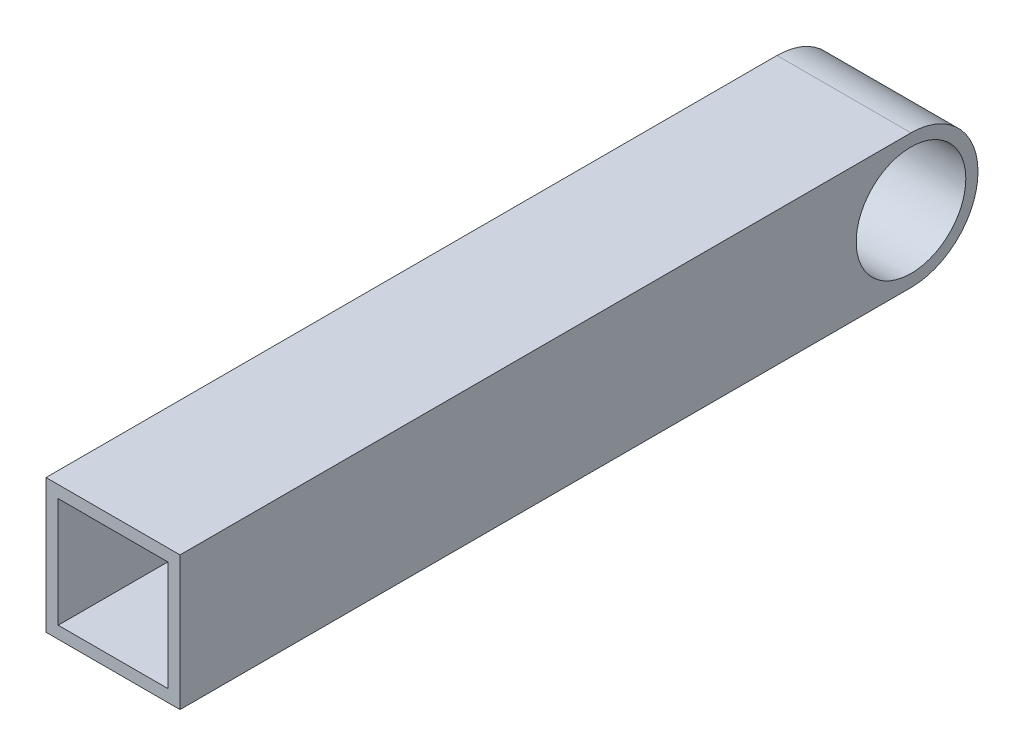
ISO-10303-21;
HEADER;
FILE_DESCRIPTION(('STEP AP214'),'2;1');
FILE_NAME('part.step','',(''),(''),'','','');
FILE_SCHEMA(('AUTOMOTIVE_DESIGN { 1 0 10303 214 1 1 1 1 }'));
ENDSEC;
DATA;
#1=APPLICATION_CONTEXT('core data for automotive mechanical design processes');
#2=APPLICATION_PROTOCOL_DEFINITION('international standard','automotive_design',2000,#1);
#3=PRODUCT_CONTEXT('',#1,'mechanical');
#4=PRODUCT('Part','Part','',(#3));
#5=PRODUCT_RELATED_PRODUCT_CATEGORY('part','',(#4));
#6=PRODUCT_DEFINITION_FORMATION('','',#4);
#7=PRODUCT_DEFINITION_CONTEXT('part definition',#1,'design');
#8=PRODUCT_DEFINITION('design','',#6,#7);
#9=PRODUCT_DEFINITION_SHAPE('','',#8);
#10=(LENGTH_UNIT() NAMED_UNIT(*) SI_UNIT(.MILLI.,.METRE.));
#11=(NAMED_UNIT(*) PLANE_ANGLE_UNIT() SI_UNIT($,.RADIAN.));
#12=(NAMED_UNIT(*) SI_UNIT($,.STERADIAN.) SOLID_ANGLE_UNIT());
#13=UNCERTAINTY_MEASURE_WITH_UNIT(LENGTH_MEASURE(1.E-05),#10,'distance_accuracy_value','');
#14=(GEOMETRIC_REPRESENTATION_CONTEXT(3) GLOBAL_UNCERTAINTY_ASSIGNED_CONTEXT((#13)) GLOBAL_UNIT_ASSIGNED_CONTEXT((#10,
#11,#12)) REPRESENTATION_CONTEXT('',''));
#15=CARTESIAN_POINT('',(0.,0.,0.));
#16=DIRECTION('',(0.,0.,1.));
#17=DIRECTION('',(1.,0.,0.));
#18=AXIS2_PLACEMENT_3D('',#15,#16,#17);
#19=CARTESIAN_POINT('',(27.5,-27.5,327.5));
#20=DIRECTION('',(-1.,0.,0.));
#21=DIRECTION('',(0.,0.,1.));
#22=AXIS2_PLACEMENT_3D('',#19,#20,#21);
#23=PLANE('',#22);
#24=CARTESIAN_POINT('',(27.5,0.,27.5));
#25=DIRECTION('',(1.,0.,0.));
#26=DIRECTION('',(0.,0.,-1.));
#27=AXIS2_PLACEMENT_3D('',#24,#25,#26);
#28=CIRCLE('',#27,22.5);
#29=CARTESIAN_POINT('',(27.5,0.,4.99999999999999));
#30=VERTEX_POINT('',#29);
#31=EDGE_CURVE('E201',#30,#30,#28,.T.);
#32=ORIENTED_EDGE('',*,*,#31,.F.);
#33=EDGE_LOOP('',(#32));
#34=FACE_BOUND('',#33,.T.);
#35=DIRECTION('',(0.,0.,-1.));
#36=VECTOR('',#35,1.);
#37=CARTESIAN_POINT('',(27.5,-27.5,327.5));
#38=LINE('',#37,#36);
#39=CARTESIAN_POINT('',(27.5,-27.5,327.5));
#40=VERTEX_POINT('',#39);
#41=CARTESIAN_POINT('',(27.5,-27.5,27.5));
#42=VERTEX_POINT('',#41);
#43=EDGE_CURVE('E228',#40,#42,#38,.T.);
#44=ORIENTED_EDGE('',*,*,#43,.T.);
#45=CARTESIAN_POINT('',(27.5,0.,27.5));
#46=DIRECTION('',(1.,0.,0.));
#47=DIRECTION('',(0.,0.,-1.));
#48=AXIS2_PLACEMENT_3D('',#45,#46,#47);
#49=CIRCLE('',#48,27.5);
#50=CARTESIAN_POINT('',(27.5,27.5,27.5));
#51=VERTEX_POINT('',#50);
#52=EDGE_CURVE('E197',#42,#51,#49,.T.);
#53=ORIENTED_EDGE('',*,*,#52,.T.);
#54=DIRECTION('',(0.,0.,-1.));
#55=VECTOR('',#54,1.);
#56=CARTESIAN_POINT('',(27.5,27.5,327.5));
#57=LINE('',#56,#55);
#58=CARTESIAN_POINT('',(27.5,27.5,327.5));
#59=VERTEX_POINT('',#58);
#60=EDGE_CURVE('E239',#59,#51,#57,.T.);
#61=ORIENTED_EDGE('',*,*,#60,.F.);
#62=DIRECTION('',(0.,1.,0.));
#63=VECTOR('',#62,1.);
#64=CARTESIAN_POINT('',(27.5,-27.5,327.5));
#65=LINE('',#64,#63);
#66=EDGE_CURVE('E215',#40,#59,#65,.T.);
#67=ORIENTED_EDGE('',*,*,#66,.F.);
#68=EDGE_LOOP('',(#44,#53,#61,#67));
#69=FACE_BOUND('',#68,.T.);
#70=ADVANCED_FACE('F61',(#34,#69),#23,.F.);
#71=CARTESIAN_POINT('',(-27.5,-27.5,327.5));
#72=DIRECTION('',(1.,0.,0.));
#73=DIRECTION('',(0.,0.,-1.));
#74=AXIS2_PLACEMENT_3D('',#71,#72,#73);
#75=PLANE('',#74);
#76=CARTESIAN_POINT('',(-27.5,0.,27.5));
#77=DIRECTION('',(1.,0.,0.));
#78=DIRECTION('',(0.,0.,-1.));
#79=AXIS2_PLACEMENT_3D('',#76,#77,#78);
#80=CIRCLE('',#79,22.5);
#81=CARTESIAN_POINT('',(-27.5,0.,4.99999999999999));
#82=VERTEX_POINT('',#81);
#83=EDGE_CURVE('E211',#82,#82,#80,.F.);
#84=ORIENTED_EDGE('',*,*,#83,.F.);
#85=EDGE_LOOP('',(#84));
#86=FACE_BOUND('',#85,.T.);
#87=CARTESIAN_POINT('',(-27.5,0.,27.5));
#88=DIRECTION('',(1.,0.,0.));
#89=DIRECTION('',(0.,0.,-1.));
#90=AXIS2_PLACEMENT_3D('',#87,#88,#89);
#91=CIRCLE('',#90,27.5);
#92=CARTESIAN_POINT('',(-27.5,27.5,27.5));
#93=VERTEX_POINT('',#92);
#94=CARTESIAN_POINT('',(-27.5,-27.5,27.5));
#95=VERTEX_POINT('',#94);
#96=EDGE_CURVE('E198',#93,#95,#91,.F.);
#97=ORIENTED_EDGE('',*,*,#96,.T.);
#98=DIRECTION('',(0.,0.,-1.));
#99=VECTOR('',#98,1.);
#100=CARTESIAN_POINT('',(-27.5,-27.5,327.5));
#101=LINE('',#100,#99);
#102=CARTESIAN_POINT('',(-27.5,-27.5,327.5));
#103=VERTEX_POINT('',#102);
#104=EDGE_CURVE('E232',#103,#95,#101,.T.);
#105=ORIENTED_EDGE('',*,*,#104,.F.);
#106=DIRECTION('',(0.,-1.,0.));
#107=VECTOR('',#106,1.);
#108=CARTESIAN_POINT('',(-27.5,-27.5,327.5));
#109=LINE('',#108,#107);
#110=CARTESIAN_POINT('',(-27.5,27.5,327.5));
#111=VERTEX_POINT('',#110);
#112=EDGE_CURVE('E222',#111,#103,#109,.T.);
#113=ORIENTED_EDGE('',*,*,#112,.F.);
#114=DIRECTION('',(0.,0.,-1.));
#115=VECTOR('',#114,1.);
#116=CARTESIAN_POINT('',(-27.5,27.5,327.5));
#117=LINE('',#116,#115);
#118=EDGE_CURVE('E235',#111,#93,#117,.T.);
#119=ORIENTED_EDGE('',*,*,#118,.T.);
#120=EDGE_LOOP('',(#97,#105,#113,#119));
#121=FACE_BOUND('',#120,.T.);
#122=ADVANCED_FACE('F280',(#86,#121),#75,.F.);
#123=CARTESIAN_POINT('',(-27.5,27.5,327.5));
#124=DIRECTION('',(0.,-1.,0.));
#125=DIRECTION('',(0.,0.,-1.));
#126=AXIS2_PLACEMENT_3D('',#123,#124,#125);
#127=PLANE('',#126);
#128=DIRECTION('',(1.,0.,0.));
#129=VECTOR('',#128,1.);
#130=CARTESIAN_POINT('',(-66.3908729652601,27.5,27.5));
#131=LINE('',#130,#129);
#132=EDGE_CURVE('E202',#93,#51,#131,.T.);
#133=ORIENTED_EDGE('',*,*,#132,.F.);
#134=ORIENTED_EDGE('',*,*,#118,.F.);
#135=DIRECTION('',(-1.,0.,0.));
#136=VECTOR('',#135,1.);
#137=CARTESIAN_POINT('',(-27.5,27.5,327.5));
#138=LINE('',#137,#136);
#139=EDGE_CURVE('E219',#59,#111,#138,.T.);
#140=ORIENTED_EDGE('',*,*,#139,.F.);
#141=ORIENTED_EDGE('',*,*,#60,.T.);
#142=EDGE_LOOP('',(#133,#134,#140,#141));
#143=FACE_BOUND('',#142,.T.);
#144=ADVANCED_FACE('F285',(#143),#127,.F.);
#145=CARTESIAN_POINT('',(-27.5,-27.5,327.5));
#146=DIRECTION('',(0.,1.,0.));
#147=DIRECTION('',(0.,0.,1.));
#148=AXIS2_PLACEMENT_3D('',#145,#146,#147);
#149=PLANE('',#148);
#150=ORIENTED_EDGE('',*,*,#104,.T.);
#151=DIRECTION('',(1.,0.,0.));
#152=VECTOR('',#151,1.);
#153=CARTESIAN_POINT('',(-66.3908729652601,-27.5,27.5));
#154=LINE('',#153,#152);
#155=EDGE_CURVE('E188',#95,#42,#154,.T.);
#156=ORIENTED_EDGE('',*,*,#155,.T.);
#157=ORIENTED_EDGE('',*,*,#43,.F.);
#158=DIRECTION('',(1.,0.,0.));
#159=VECTOR('',#158,1.);
#160=CARTESIAN_POINT('',(-27.5,-27.5,327.5));
#161=LINE('',#160,#159);
#162=EDGE_CURVE('E225',#103,#40,#161,.T.);
#163=ORIENTED_EDGE('',*,*,#162,.F.);
#164=EDGE_LOOP('',(#150,#156,#157,#163));
#165=FACE_BOUND('',#164,.T.);
#166=ADVANCED_FACE('F295',(#165),#149,.F.);
#167=CARTESIAN_POINT('',(0.,0.,327.5));
#168=DIRECTION('',(0.,0.,-1.));
#169=DIRECTION('',(-1.,0.,0.));
#170=AXIS2_PLACEMENT_3D('',#167,#168,#169);
#171=PLANE('',#170);
#172=DIRECTION('',(-1.,0.,0.));
#173=VECTOR('',#172,1.);
#174=CARTESIAN_POINT('',(-22.5,22.5,327.5));
#175=LINE('',#174,#173);
#176=CARTESIAN_POINT('',(22.5,22.5,327.5));
#177=VERTEX_POINT('',#176);
#178=CARTESIAN_POINT('',(-22.5,22.5,327.5));
#179=VERTEX_POINT('',#178);
#180=EDGE_CURVE('E175',#177,#179,#175,.T.);
#181=ORIENTED_EDGE('',*,*,#180,.F.);
#182=DIRECTION('',(0.,1.,0.));
#183=VECTOR('',#182,1.);
#184=CARTESIAN_POINT('',(22.5,-22.5,327.5));
#185=LINE('',#184,#183);
#186=CARTESIAN_POINT('',(22.5,-22.5,327.5));
#187=VERTEX_POINT('',#186);
#188=EDGE_CURVE('E76',#187,#177,#185,.T.);
#189=ORIENTED_EDGE('',*,*,#188,.F.);
#190=DIRECTION('',(1.,0.,0.));
#191=VECTOR('',#190,1.);
#192=CARTESIAN_POINT('',(-22.5,-22.5,327.5));
#193=LINE('',#192,#191);
#194=CARTESIAN_POINT('',(-22.5,-22.5,327.5));
#195=VERTEX_POINT('',#194);
#196=EDGE_CURVE('E147',#195,#187,#193,.T.);
#197=ORIENTED_EDGE('',*,*,#196,.F.);
#198=DIRECTION('',(0.,-1.,0.));
#199=VECTOR('',#198,1.);
#200=CARTESIAN_POINT('',(-22.5,-22.5,327.5));
#201=LINE('',#200,#199);
#202=EDGE_CURVE('E178',#179,#195,#201,.T.);
#203=ORIENTED_EDGE('',*,*,#202,.F.);
#204=EDGE_LOOP('',(#181,#189,#197,#203));
#205=FACE_BOUND('',#204,.T.);
#206=ORIENTED_EDGE('',*,*,#66,.T.);
#207=ORIENTED_EDGE('',*,*,#139,.T.);
#208=ORIENTED_EDGE('',*,*,#112,.T.);
#209=ORIENTED_EDGE('',*,*,#162,.T.);
#210=EDGE_LOOP('',(#206,#207,#208,#209));
#211=FACE_BOUND('',#210,.T.);
#212=ADVANCED_FACE('F264',(#205,#211),#171,.F.);
#213=CARTESIAN_POINT('',(-91.1396103067893,0.,27.5));
#214=DIRECTION('',(1.,0.,0.));
#215=DIRECTION('',(0.,0.,-1.));
#216=AXIS2_PLACEMENT_3D('',#213,#214,#215);
#217=CYLINDRICAL_SURFACE('',#216,22.5);
#218=CARTESIAN_POINT('',(22.5,0.,27.5));
#219=DIRECTION('',(1.,0.,0.));
#220=DIRECTION('',(0.,0.,-1.));
#221=AXIS2_PLACEMENT_3D('',#218,#219,#220);
#222=CIRCLE('',#221,22.5);
#223=CARTESIAN_POINT('',(22.5,-10.3077640640443,47.4999999999999));
#224=VERTEX_POINT('',#223);
#225=CARTESIAN_POINT('',(22.5,10.3077640640443,47.4999999999999));
#226=VERTEX_POINT('',#225);
#227=EDGE_CURVE('E69',#224,#226,#222,.F.);
#228=ORIENTED_EDGE('',*,*,#227,.T.);
#229=DIRECTION('',(1.,0.,0.));
#230=VECTOR('',#229,1.);
#231=CARTESIAN_POINT('',(-91.1396103067893,10.3077640640443,47.4999999999999));
#232=LINE('',#231,#230);
#233=CARTESIAN_POINT('',(-22.5,10.3077640640443,47.4999999999999));
#234=VERTEX_POINT('',#233);
#235=EDGE_CURVE('E12',#226,#234,#232,.F.);
#236=ORIENTED_EDGE('',*,*,#235,.T.);
#237=CARTESIAN_POINT('',(-22.5,0.,27.5));
#238=DIRECTION('',(-1.,0.,0.));
#239=DIRECTION('',(0.,0.,1.));
#240=AXIS2_PLACEMENT_3D('',#237,#238,#239);
#241=CIRCLE('',#240,22.5);
#242=CARTESIAN_POINT('',(-22.5,-10.3077640640443,47.4999999999999));
#243=VERTEX_POINT('',#242);
#244=EDGE_CURVE('E247',#234,#243,#241,.F.);
#245=ORIENTED_EDGE('',*,*,#244,.T.);
#246=DIRECTION('',(1.,0.,0.));
#247=VECTOR('',#246,1.);
#248=CARTESIAN_POINT('',(-91.1396103067893,-10.3077640640443,47.4999999999999));
#249=LINE('',#248,#247);
#250=EDGE_CURVE('E243',#243,#224,#249,.T.);
#251=ORIENTED_EDGE('',*,*,#250,.T.);
#252=EDGE_LOOP('',(#228,#236,#245,#251));
#253=FACE_BOUND('',#252,.T.);
#254=ORIENTED_EDGE('',*,*,#83,.T.);
#255=EDGE_LOOP('',(#254));
#256=FACE_BOUND('',#255,.T.);
#257=ORIENTED_EDGE('',*,*,#31,.T.);
#258=EDGE_LOOP('',(#257));
#259=FACE_BOUND('',#258,.T.);
#260=ADVANCED_FACE('F253',(#253,#256,#259),#217,.F.);
#261=CARTESIAN_POINT('',(-66.3908729652601,0.,27.5));
#262=DIRECTION('',(1.,0.,0.));
#263=DIRECTION('',(0.,0.,-1.));
#264=AXIS2_PLACEMENT_3D('',#261,#262,#263);
#265=CYLINDRICAL_SURFACE('',#264,27.5);
#266=ORIENTED_EDGE('',*,*,#132,.T.);
#267=ORIENTED_EDGE('',*,*,#52,.F.);
#268=ORIENTED_EDGE('',*,*,#155,.F.);
#269=ORIENTED_EDGE('',*,*,#96,.F.);
#270=EDGE_LOOP('',(#266,#267,#268,#269));
#271=FACE_BOUND('',#270,.T.);
#272=ADVANCED_FACE('F275',(#271),#265,.T.);
#273=CARTESIAN_POINT('',(22.5,-22.5,47.4999999999999));
#274=DIRECTION('',(1.,0.,0.));
#275=DIRECTION('',(0.,0.,-1.));
#276=AXIS2_PLACEMENT_3D('',#273,#274,#275);
#277=PLANE('',#276);
#278=DIRECTION('',(0.,1.,0.));
#279=VECTOR('',#278,1.);
#280=CARTESIAN_POINT('',(22.5,-22.5,47.4999999999999));
#281=LINE('',#280,#279);
#282=CARTESIAN_POINT('',(22.5,-22.5,47.4999999999999));
#283=VERTEX_POINT('',#282);
#284=EDGE_CURVE('E84',#283,#224,#281,.T.);
#285=ORIENTED_EDGE('',*,*,#284,.F.);
#286=DIRECTION('',(0.,0.,1.));
#287=VECTOR('',#286,1.);
#288=CARTESIAN_POINT('',(22.5,-22.5,47.4999999999999));
#289=LINE('',#288,#287);
#290=EDGE_CURVE('E185',#283,#187,#289,.T.);
#291=ORIENTED_EDGE('',*,*,#290,.T.);
#292=ORIENTED_EDGE('',*,*,#188,.T.);
#293=DIRECTION('',(0.,0.,1.));
#294=VECTOR('',#293,1.);
#295=CARTESIAN_POINT('',(22.5,22.5,47.4999999999999));
#296=LINE('',#295,#294);
#297=CARTESIAN_POINT('',(22.5,22.5,47.4999999999999));
#298=VERTEX_POINT('',#297);
#299=EDGE_CURVE('E149',#298,#177,#296,.T.);
#300=ORIENTED_EDGE('',*,*,#299,.F.);
#301=EDGE_CURVE('E140',#226,#298,#281,.T.);
#302=ORIENTED_EDGE('',*,*,#301,.F.);
#303=ORIENTED_EDGE('',*,*,#227,.F.);
#304=EDGE_LOOP('',(#285,#291,#292,#300,#302,#303));
#305=FACE_BOUND('',#304,.T.);
#306=ADVANCED_FACE('F150',(#305),#277,.F.);
#307=CARTESIAN_POINT('',(-22.5,-22.5,47.4999999999999));
#308=DIRECTION('',(-1.,0.,0.));
#309=DIRECTION('',(0.,0.,1.));
#310=AXIS2_PLACEMENT_3D('',#307,#308,#309);
#311=PLANE('',#310);
#312=DIRECTION('',(0.,-1.,0.));
#313=VECTOR('',#312,1.);
#314=CARTESIAN_POINT('',(-22.5,-22.5,47.4999999999999));
#315=LINE('',#314,#313);
#316=CARTESIAN_POINT('',(-22.5,22.5,47.4999999999999));
#317=VERTEX_POINT('',#316);
#318=EDGE_CURVE('E167',#317,#234,#315,.T.);
#319=ORIENTED_EDGE('',*,*,#318,.F.);
#320=DIRECTION('',(0.,0.,1.));
#321=VECTOR('',#320,1.);
#322=CARTESIAN_POINT('',(-22.5,22.5,47.4999999999999));
#323=LINE('',#322,#321);
#324=EDGE_CURVE('E155',#317,#179,#323,.T.);
#325=ORIENTED_EDGE('',*,*,#324,.T.);
#326=ORIENTED_EDGE('',*,*,#202,.T.);
#327=DIRECTION('',(0.,0.,1.));
#328=VECTOR('',#327,1.);
#329=CARTESIAN_POINT('',(-22.5,-22.5,47.4999999999999));
#330=LINE('',#329,#328);
#331=CARTESIAN_POINT('',(-22.5,-22.5,47.4999999999999));
#332=VERTEX_POINT('',#331);
#333=EDGE_CURVE('E189',#332,#195,#330,.T.);
#334=ORIENTED_EDGE('',*,*,#333,.F.);
#335=EDGE_CURVE('E161',#243,#332,#315,.T.);
#336=ORIENTED_EDGE('',*,*,#335,.F.);
#337=ORIENTED_EDGE('',*,*,#244,.F.);
#338=EDGE_LOOP('',(#319,#325,#326,#334,#336,#337));
#339=FACE_BOUND('',#338,.T.);
#340=ADVANCED_FACE('F267',(#339),#311,.F.);
#341=CARTESIAN_POINT('',(0.,0.,47.4999999999999));
#342=DIRECTION('',(0.,0.,-1.));
#343=DIRECTION('',(-1.,0.,0.));
#344=AXIS2_PLACEMENT_3D('',#341,#342,#343);
#345=PLANE('',#344);
#346=ORIENTED_EDGE('',*,*,#301,.T.);
#347=DIRECTION('',(-1.,0.,0.));
#348=VECTOR('',#347,1.);
#349=CARTESIAN_POINT('',(-22.5,22.5,47.4999999999999));
#350=LINE('',#349,#348);
#351=EDGE_CURVE('E144',#298,#317,#350,.T.);
#352=ORIENTED_EDGE('',*,*,#351,.T.);
#353=ORIENTED_EDGE('',*,*,#318,.T.);
#354=ORIENTED_EDGE('',*,*,#235,.F.);
#355=EDGE_LOOP('',(#346,#352,#353,#354));
#356=FACE_BOUND('',#355,.T.);
#357=ADVANCED_FACE('F141',(#356),#345,.F.);
#358=ORIENTED_EDGE('',*,*,#335,.T.);
#359=DIRECTION('',(1.,0.,0.));
#360=VECTOR('',#359,1.);
#361=CARTESIAN_POINT('',(-22.5,-22.5,47.4999999999999));
#362=LINE('',#361,#360);
#363=EDGE_CURVE('E156',#332,#283,#362,.T.);
#364=ORIENTED_EDGE('',*,*,#363,.T.);
#365=ORIENTED_EDGE('',*,*,#284,.T.);
#366=ORIENTED_EDGE('',*,*,#250,.F.);
#367=EDGE_LOOP('',(#358,#364,#365,#366));
#368=FACE_BOUND('',#367,.T.);
#369=ADVANCED_FACE('F256',(#368),#345,.F.);
#370=CARTESIAN_POINT('',(-22.5,-22.5,47.4999999999999));
#371=DIRECTION('',(0.,-1.,0.));
#372=DIRECTION('',(0.,0.,-1.));
#373=AXIS2_PLACEMENT_3D('',#370,#371,#372);
#374=PLANE('',#373);
#375=ORIENTED_EDGE('',*,*,#196,.T.);
#376=ORIENTED_EDGE('',*,*,#290,.F.);
#377=ORIENTED_EDGE('',*,*,#363,.F.);
#378=ORIENTED_EDGE('',*,*,#333,.T.);
#379=EDGE_LOOP('',(#375,#376,#377,#378));
#380=FACE_BOUND('',#379,.T.);
#381=ADVANCED_FACE('F260',(#380),#374,.F.);
#382=CARTESIAN_POINT('',(-22.5,22.5,47.4999999999999));
#383=DIRECTION('',(0.,1.,0.));
#384=DIRECTION('',(0.,0.,1.));
#385=AXIS2_PLACEMENT_3D('',#382,#383,#384);
#386=PLANE('',#385);
#387=ORIENTED_EDGE('',*,*,#180,.T.);
#388=ORIENTED_EDGE('',*,*,#324,.F.);
#389=ORIENTED_EDGE('',*,*,#351,.F.);
#390=ORIENTED_EDGE('',*,*,#299,.T.);
#391=EDGE_LOOP('',(#387,#388,#389,#390));
#392=FACE_BOUND('',#391,.T.);
#393=ADVANCED_FACE('F158',(#392),#386,.F.);
#394=CLOSED_SHELL('',(#70,#122,#144,#166,#212,#260,#272,#306,#340,#357,#369,#381,#393));
#395=MANIFOLD_SOLID_BREP('B2',#394);
#396=ADVANCED_BREP_SHAPE_REPRESENTATION('',(#18,#395),#14);
#397=SHAPE_DEFINITION_REPRESENTATION(#9,#396);
ENDSEC;
END-ISO-10303-21;
